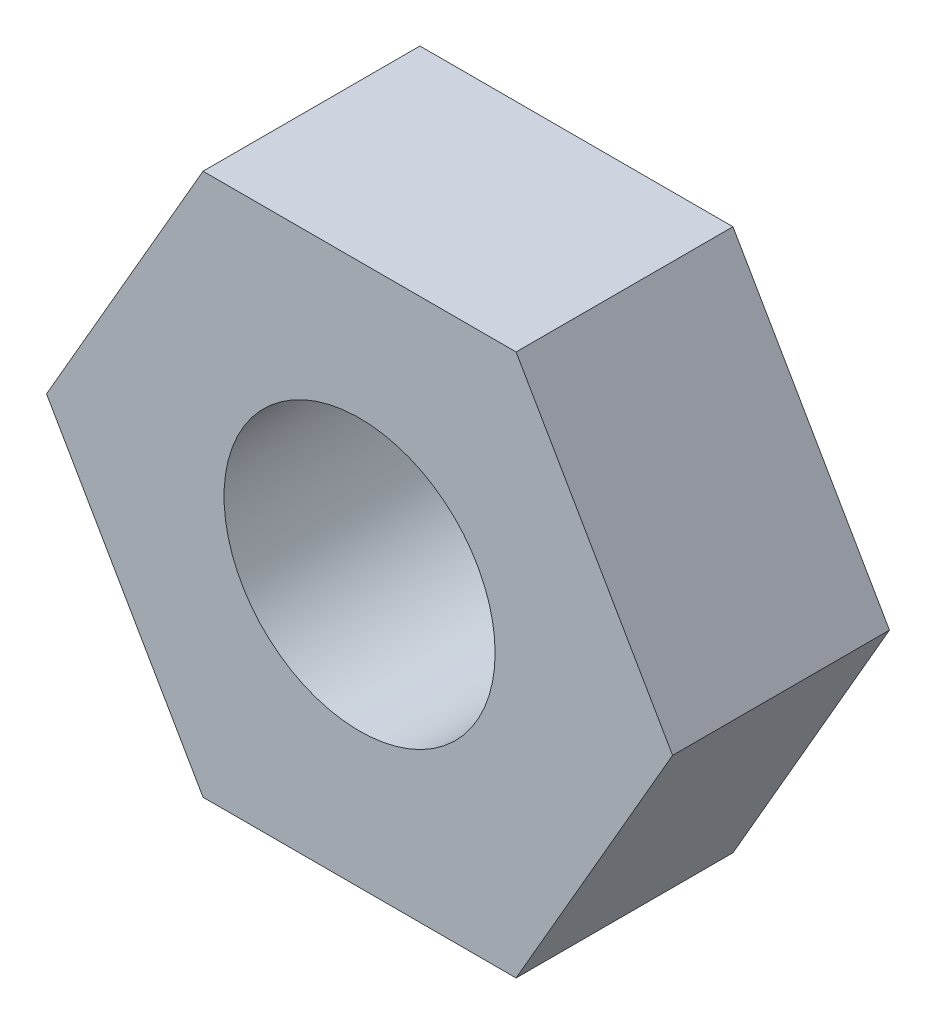
ISO-10303-21;
HEADER;
FILE_DESCRIPTION(('STEP AP214'),'2;1');
FILE_NAME('part.step','',(''),(''),'','','');
FILE_SCHEMA(('AUTOMOTIVE_DESIGN { 1 0 10303 214 1 1 1 1 }'));
ENDSEC;
DATA;
#1=APPLICATION_CONTEXT('core data for automotive mechanical design processes');
#2=APPLICATION_PROTOCOL_DEFINITION('international standard','automotive_design',2000,#1);
#3=PRODUCT_CONTEXT('',#1,'mechanical');
#4=PRODUCT('Part','Part','',(#3));
#5=PRODUCT_RELATED_PRODUCT_CATEGORY('part','',(#4));
#6=PRODUCT_DEFINITION_FORMATION('','',#4);
#7=PRODUCT_DEFINITION_CONTEXT('part definition',#1,'design');
#8=PRODUCT_DEFINITION('design','',#6,#7);
#9=PRODUCT_DEFINITION_SHAPE('','',#8);
#10=(LENGTH_UNIT() NAMED_UNIT(*) SI_UNIT(.MILLI.,.METRE.));
#11=(NAMED_UNIT(*) PLANE_ANGLE_UNIT() SI_UNIT($,.RADIAN.));
#12=(NAMED_UNIT(*) SI_UNIT($,.STERADIAN.) SOLID_ANGLE_UNIT());
#13=UNCERTAINTY_MEASURE_WITH_UNIT(LENGTH_MEASURE(1.E-05),#10,'distance_accuracy_value','');
#14=(GEOMETRIC_REPRESENTATION_CONTEXT(3) GLOBAL_UNCERTAINTY_ASSIGNED_CONTEXT((#13)) GLOBAL_UNIT_ASSIGNED_CONTEXT((#10,
#11,#12)) REPRESENTATION_CONTEXT('',''));
#15=CARTESIAN_POINT('',(0.,0.,0.));
#16=DIRECTION('',(0.,0.,1.));
#17=DIRECTION('',(1.,0.,0.));
#18=AXIS2_PLACEMENT_3D('',#15,#16,#17);
#19=CARTESIAN_POINT('',(0.,0.,1.6));
#20=DIRECTION('',(0.,0.,1.));
#21=DIRECTION('',(1.,0.,0.));
#22=AXIS2_PLACEMENT_3D('',#19,#20,#21);
#23=PLANE('',#22);
#24=DIRECTION('',(0.5,0.866025403784439,0.));
#25=VECTOR('',#24,1.);
#26=CARTESIAN_POINT('',(1.15470053837925,-2.,1.6));
#27=LINE('',#26,#25);
#28=CARTESIAN_POINT('',(1.15470053837925,-2.,1.6));
#29=VERTEX_POINT('',#28);
#30=CARTESIAN_POINT('',(2.3094010767585,0.,1.6));
#31=VERTEX_POINT('',#30);
#32=EDGE_CURVE('E132',#29,#31,#27,.T.);
#33=ORIENTED_EDGE('',*,*,#32,.T.);
#34=DIRECTION('',(-0.5,0.866025403784439,0.));
#35=VECTOR('',#34,1.);
#36=CARTESIAN_POINT('',(2.3094010767585,0.,1.6));
#37=LINE('',#36,#35);
#38=CARTESIAN_POINT('',(1.15470053837925,2.,1.6));
#39=VERTEX_POINT('',#38);
#40=EDGE_CURVE('E91',#31,#39,#37,.T.);
#41=ORIENTED_EDGE('',*,*,#40,.T.);
#42=DIRECTION('',(-1.,0.,0.));
#43=VECTOR('',#42,1.);
#44=CARTESIAN_POINT('',(1.15470053837925,2.,1.6));
#45=LINE('',#44,#43);
#46=CARTESIAN_POINT('',(-1.15470053837925,2.,1.6));
#47=VERTEX_POINT('',#46);
#48=EDGE_CURVE('E106',#39,#47,#45,.T.);
#49=ORIENTED_EDGE('',*,*,#48,.T.);
#50=DIRECTION('',(-0.5,-0.866025403784439,0.));
#51=VECTOR('',#50,1.);
#52=CARTESIAN_POINT('',(-1.15470053837925,2.,1.6));
#53=LINE('',#52,#51);
#54=CARTESIAN_POINT('',(-2.3094010767585,0.,1.6));
#55=VERTEX_POINT('',#54);
#56=EDGE_CURVE('E99',#47,#55,#53,.T.);
#57=ORIENTED_EDGE('',*,*,#56,.T.);
#58=DIRECTION('',(0.5,-0.866025403784439,0.));
#59=VECTOR('',#58,1.);
#60=CARTESIAN_POINT('',(-2.3094010767585,0.,1.6));
#61=LINE('',#60,#59);
#62=CARTESIAN_POINT('',(-1.15470053837925,-2.,1.6));
#63=VERTEX_POINT('',#62);
#64=EDGE_CURVE('E102',#55,#63,#61,.T.);
#65=ORIENTED_EDGE('',*,*,#64,.T.);
#66=DIRECTION('',(1.,0.,0.));
#67=VECTOR('',#66,1.);
#68=CARTESIAN_POINT('',(-1.15470053837925,-2.,1.6));
#69=LINE('',#68,#67);
#70=EDGE_CURVE('E57',#63,#29,#69,.T.);
#71=ORIENTED_EDGE('',*,*,#70,.T.);
#72=EDGE_LOOP('',(#33,#41,#49,#57,#65,#71));
#73=FACE_BOUND('',#72,.T.);
#74=CARTESIAN_POINT('',(0.,0.,1.6));
#75=DIRECTION('',(0.,0.,1.));
#76=DIRECTION('',(1.,0.,0.));
#77=AXIS2_PLACEMENT_3D('',#74,#75,#76);
#78=CIRCLE('',#77,1.);
#79=CARTESIAN_POINT('',(1.,0.,1.6));
#80=VERTEX_POINT('',#79);
#81=EDGE_CURVE('E126',#80,#80,#78,.T.);
#82=ORIENTED_EDGE('',*,*,#81,.F.);
#83=EDGE_LOOP('',(#82));
#84=FACE_BOUND('',#83,.T.);
#85=ADVANCED_FACE('F39',(#73,#84),#23,.T.);
#86=CARTESIAN_POINT('',(0.,0.,0.));
#87=DIRECTION('',(0.,0.,1.));
#88=DIRECTION('',(1.,0.,0.));
#89=AXIS2_PLACEMENT_3D('',#86,#87,#88);
#90=PLANE('',#89);
#91=DIRECTION('',(0.5,0.866025403784439,0.));
#92=VECTOR('',#91,1.);
#93=CARTESIAN_POINT('',(1.15470053837925,-2.,0.));
#94=LINE('',#93,#92);
#95=CARTESIAN_POINT('',(1.15470053837925,-2.,0.));
#96=VERTEX_POINT('',#95);
#97=CARTESIAN_POINT('',(2.3094010767585,0.,0.));
#98=VERTEX_POINT('',#97);
#99=EDGE_CURVE('E123',#96,#98,#94,.T.);
#100=ORIENTED_EDGE('',*,*,#99,.F.);
#101=DIRECTION('',(1.,0.,0.));
#102=VECTOR('',#101,1.);
#103=CARTESIAN_POINT('',(-1.15470053837925,-2.,0.));
#104=LINE('',#103,#102);
#105=CARTESIAN_POINT('',(-1.15470053837925,-2.,0.));
#106=VERTEX_POINT('',#105);
#107=EDGE_CURVE('E85',#106,#96,#104,.T.);
#108=ORIENTED_EDGE('',*,*,#107,.F.);
#109=DIRECTION('',(0.5,-0.866025403784439,0.));
#110=VECTOR('',#109,1.);
#111=CARTESIAN_POINT('',(-2.3094010767585,0.,0.));
#112=LINE('',#111,#110);
#113=CARTESIAN_POINT('',(-2.3094010767585,0.,0.));
#114=VERTEX_POINT('',#113);
#115=EDGE_CURVE('E78',#114,#106,#112,.T.);
#116=ORIENTED_EDGE('',*,*,#115,.F.);
#117=DIRECTION('',(-0.5,-0.866025403784439,0.));
#118=VECTOR('',#117,1.);
#119=CARTESIAN_POINT('',(-1.15470053837925,2.,0.));
#120=LINE('',#119,#118);
#121=CARTESIAN_POINT('',(-1.15470053837925,2.,0.));
#122=VERTEX_POINT('',#121);
#123=EDGE_CURVE('E111',#122,#114,#120,.T.);
#124=ORIENTED_EDGE('',*,*,#123,.F.);
#125=DIRECTION('',(-1.,0.,0.));
#126=VECTOR('',#125,1.);
#127=CARTESIAN_POINT('',(1.15470053837925,2.,0.));
#128=LINE('',#127,#126);
#129=CARTESIAN_POINT('',(1.15470053837925,2.,0.));
#130=VERTEX_POINT('',#129);
#131=EDGE_CURVE('E128',#130,#122,#128,.T.);
#132=ORIENTED_EDGE('',*,*,#131,.F.);
#133=DIRECTION('',(-0.5,0.866025403784439,0.));
#134=VECTOR('',#133,1.);
#135=CARTESIAN_POINT('',(2.3094010767585,0.,0.));
#136=LINE('',#135,#134);
#137=EDGE_CURVE('E130',#98,#130,#136,.T.);
#138=ORIENTED_EDGE('',*,*,#137,.F.);
#139=EDGE_LOOP('',(#100,#108,#116,#124,#132,#138));
#140=FACE_BOUND('',#139,.T.);
#141=CARTESIAN_POINT('',(0.,0.,0.));
#142=DIRECTION('',(0.,0.,1.));
#143=DIRECTION('',(1.,0.,0.));
#144=AXIS2_PLACEMENT_3D('',#141,#142,#143);
#145=CIRCLE('',#144,1.);
#146=CARTESIAN_POINT('',(1.,0.,0.));
#147=VERTEX_POINT('',#146);
#148=EDGE_CURVE('E230',#147,#147,#145,.T.);
#149=ORIENTED_EDGE('',*,*,#148,.T.);
#150=EDGE_LOOP('',(#149));
#151=FACE_BOUND('',#150,.T.);
#152=ADVANCED_FACE('F145',(#140,#151),#90,.F.);
#153=CARTESIAN_POINT('',(1.15470053837925,-2.,1.6));
#154=DIRECTION('',(-0.866025403784439,0.5,0.));
#155=DIRECTION('',(-0.5,-0.866025403784439,0.));
#156=AXIS2_PLACEMENT_3D('',#153,#154,#155);
#157=PLANE('',#156);
#158=ORIENTED_EDGE('',*,*,#99,.T.);
#159=DIRECTION('',(0.,0.,-1.));
#160=VECTOR('',#159,1.);
#161=CARTESIAN_POINT('',(2.3094010767585,0.,1.6));
#162=LINE('',#161,#160);
#163=EDGE_CURVE('E11',#31,#98,#162,.T.);
#164=ORIENTED_EDGE('',*,*,#163,.F.);
#165=ORIENTED_EDGE('',*,*,#32,.F.);
#166=DIRECTION('',(0.,0.,-1.));
#167=VECTOR('',#166,1.);
#168=CARTESIAN_POINT('',(1.15470053837925,-2.,1.6));
#169=LINE('',#168,#167);
#170=EDGE_CURVE('E117',#29,#96,#169,.T.);
#171=ORIENTED_EDGE('',*,*,#170,.T.);
#172=EDGE_LOOP('',(#158,#164,#165,#171));
#173=FACE_BOUND('',#172,.T.);
#174=ADVANCED_FACE('F41',(#173),#157,.F.);
#175=CARTESIAN_POINT('',(2.3094010767585,0.,1.6));
#176=DIRECTION('',(-0.866025403784439,-0.5,0.));
#177=DIRECTION('',(0.5,-0.866025403784439,0.));
#178=AXIS2_PLACEMENT_3D('',#175,#176,#177);
#179=PLANE('',#178);
#180=ORIENTED_EDGE('',*,*,#137,.T.);
#181=DIRECTION('',(0.,0.,-1.));
#182=VECTOR('',#181,1.);
#183=CARTESIAN_POINT('',(1.15470053837925,2.,1.6));
#184=LINE('',#183,#182);
#185=EDGE_CURVE('E48',#39,#130,#184,.T.);
#186=ORIENTED_EDGE('',*,*,#185,.F.);
#187=ORIENTED_EDGE('',*,*,#40,.F.);
#188=ORIENTED_EDGE('',*,*,#163,.T.);
#189=EDGE_LOOP('',(#180,#186,#187,#188));
#190=FACE_BOUND('',#189,.T.);
#191=ADVANCED_FACE('F166',(#190),#179,.F.);
#192=CARTESIAN_POINT('',(1.15470053837925,2.,1.6));
#193=DIRECTION('',(0.,-1.,0.));
#194=DIRECTION('',(1.,0.,0.));
#195=AXIS2_PLACEMENT_3D('',#192,#193,#194);
#196=PLANE('',#195);
#197=ORIENTED_EDGE('',*,*,#131,.T.);
#198=DIRECTION('',(0.,0.,-1.));
#199=VECTOR('',#198,1.);
#200=CARTESIAN_POINT('',(-1.15470053837925,2.,1.6));
#201=LINE('',#200,#199);
#202=EDGE_CURVE('E113',#47,#122,#201,.T.);
#203=ORIENTED_EDGE('',*,*,#202,.F.);
#204=ORIENTED_EDGE('',*,*,#48,.F.);
#205=ORIENTED_EDGE('',*,*,#185,.T.);
#206=EDGE_LOOP('',(#197,#203,#204,#205));
#207=FACE_BOUND('',#206,.T.);
#208=ADVANCED_FACE('F143',(#207),#196,.F.);
#209=CARTESIAN_POINT('',(-1.15470053837925,2.,1.6));
#210=DIRECTION('',(0.866025403784439,-0.5,0.));
#211=DIRECTION('',(0.5,0.866025403784439,0.));
#212=AXIS2_PLACEMENT_3D('',#209,#210,#211);
#213=PLANE('',#212);
#214=ORIENTED_EDGE('',*,*,#123,.T.);
#215=DIRECTION('',(0.,0.,-1.));
#216=VECTOR('',#215,1.);
#217=CARTESIAN_POINT('',(-2.3094010767585,0.,1.6));
#218=LINE('',#217,#216);
#219=EDGE_CURVE('E112',#55,#114,#218,.T.);
#220=ORIENTED_EDGE('',*,*,#219,.F.);
#221=ORIENTED_EDGE('',*,*,#56,.F.);
#222=ORIENTED_EDGE('',*,*,#202,.T.);
#223=EDGE_LOOP('',(#214,#220,#221,#222));
#224=FACE_BOUND('',#223,.T.);
#225=ADVANCED_FACE('F115',(#224),#213,.F.);
#226=CARTESIAN_POINT('',(-2.3094010767585,0.,1.6));
#227=DIRECTION('',(0.866025403784439,0.5,0.));
#228=DIRECTION('',(-0.5,0.866025403784439,0.));
#229=AXIS2_PLACEMENT_3D('',#226,#227,#228);
#230=PLANE('',#229);
#231=ORIENTED_EDGE('',*,*,#115,.T.);
#232=DIRECTION('',(0.,0.,-1.));
#233=VECTOR('',#232,1.);
#234=CARTESIAN_POINT('',(-1.15470053837925,-2.,1.6));
#235=LINE('',#234,#233);
#236=EDGE_CURVE('E119',#63,#106,#235,.T.);
#237=ORIENTED_EDGE('',*,*,#236,.F.);
#238=ORIENTED_EDGE('',*,*,#64,.F.);
#239=ORIENTED_EDGE('',*,*,#219,.T.);
#240=EDGE_LOOP('',(#231,#237,#238,#239));
#241=FACE_BOUND('',#240,.T.);
#242=ADVANCED_FACE('F120',(#241),#230,.F.);
#243=CARTESIAN_POINT('',(-1.15470053837925,-2.,1.6));
#244=DIRECTION('',(0.,1.,0.));
#245=DIRECTION('',(0.,0.,1.));
#246=AXIS2_PLACEMENT_3D('',#243,#244,#245);
#247=PLANE('',#246);
#248=ORIENTED_EDGE('',*,*,#107,.T.);
#249=ORIENTED_EDGE('',*,*,#170,.F.);
#250=ORIENTED_EDGE('',*,*,#70,.F.);
#251=ORIENTED_EDGE('',*,*,#236,.T.);
#252=EDGE_LOOP('',(#248,#249,#250,#251));
#253=FACE_BOUND('',#252,.T.);
#254=ADVANCED_FACE('F149',(#253),#247,.F.);
#255=CARTESIAN_POINT('',(0.,0.,1.6));
#256=DIRECTION('',(0.,0.,-1.));
#257=DIRECTION('',(-1.,0.,0.));
#258=AXIS2_PLACEMENT_3D('',#255,#256,#257);
#259=CYLINDRICAL_SURFACE('',#258,1.);
#260=ORIENTED_EDGE('',*,*,#81,.T.);
#261=EDGE_LOOP('',(#260));
#262=FACE_BOUND('',#261,.T.);
#263=ORIENTED_EDGE('',*,*,#148,.F.);
#264=EDGE_LOOP('',(#263));
#265=FACE_BOUND('',#264,.T.);
#266=ADVANCED_FACE('F151',(#262,#265),#259,.F.);
#267=CLOSED_SHELL('',(#85,#152,#174,#191,#208,#225,#242,#254,#266));
#268=MANIFOLD_SOLID_BREP('B2',#267);
#269=ADVANCED_BREP_SHAPE_REPRESENTATION('',(#18,#268),#14);
#270=SHAPE_DEFINITION_REPRESENTATION(#9,#269);
ENDSEC;
END-ISO-10303-21;
